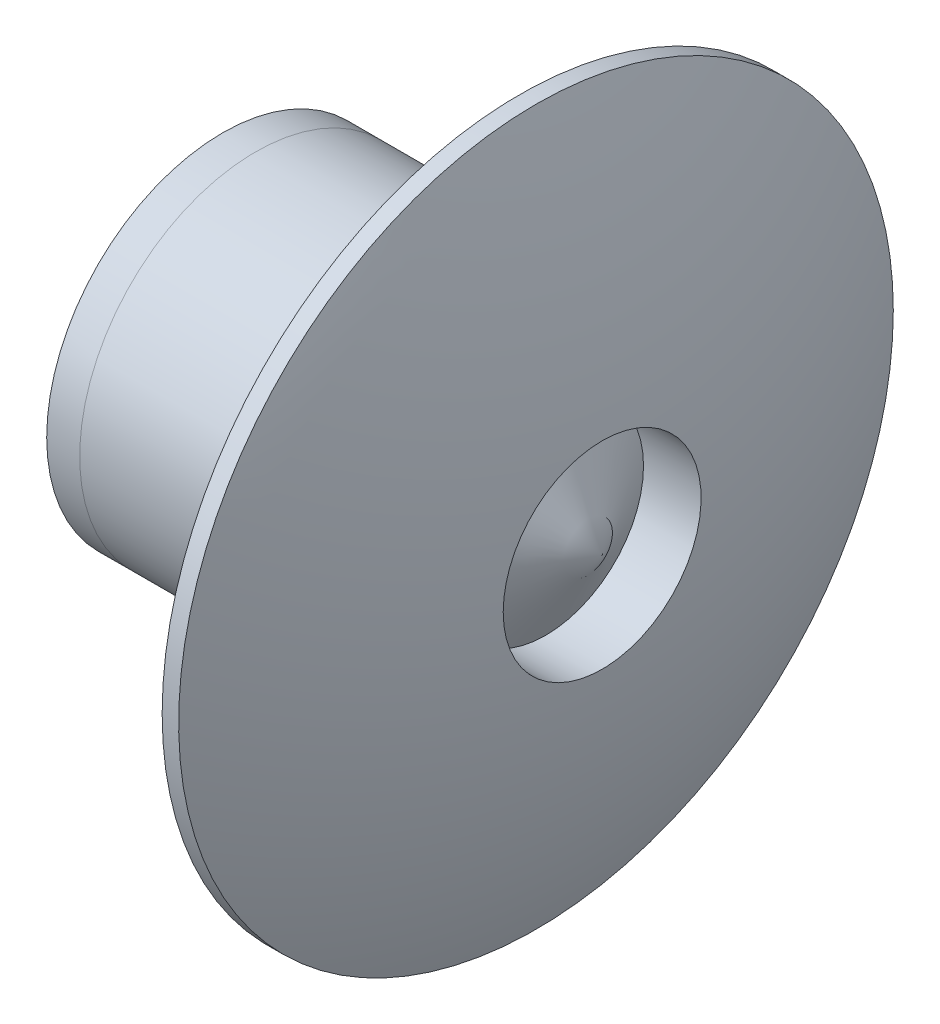
ISO-10303-21;
HEADER;
FILE_DESCRIPTION(('STEP AP214'),'2;1');
FILE_NAME('part.step','',(''),(''),'','','');
FILE_SCHEMA(('AUTOMOTIVE_DESIGN { 1 0 10303 214 1 1 1 1 }'));
ENDSEC;
DATA;
#1=APPLICATION_CONTEXT('core data for automotive mechanical design processes');
#2=APPLICATION_PROTOCOL_DEFINITION('international standard','automotive_design',2000,#1);
#3=PRODUCT_CONTEXT('',#1,'mechanical');
#4=PRODUCT('Part','Part','',(#3));
#5=PRODUCT_RELATED_PRODUCT_CATEGORY('part','',(#4));
#6=PRODUCT_DEFINITION_FORMATION('','',#4);
#7=PRODUCT_DEFINITION_CONTEXT('part definition',#1,'design');
#8=PRODUCT_DEFINITION('design','',#6,#7);
#9=PRODUCT_DEFINITION_SHAPE('','',#8);
#10=(LENGTH_UNIT() NAMED_UNIT(*) SI_UNIT(.MILLI.,.METRE.));
#11=(NAMED_UNIT(*) PLANE_ANGLE_UNIT() SI_UNIT($,.RADIAN.));
#12=(NAMED_UNIT(*) SI_UNIT($,.STERADIAN.) SOLID_ANGLE_UNIT());
#13=UNCERTAINTY_MEASURE_WITH_UNIT(LENGTH_MEASURE(1.E-05),#10,'distance_accuracy_value','');
#14=(GEOMETRIC_REPRESENTATION_CONTEXT(3) GLOBAL_UNCERTAINTY_ASSIGNED_CONTEXT((#13)) GLOBAL_UNIT_ASSIGNED_CONTEXT((#10,
#11,#12)) REPRESENTATION_CONTEXT('',''));
#15=CARTESIAN_POINT('',(0.,0.,0.));
#16=DIRECTION('',(0.,0.,1.));
#17=DIRECTION('',(1.,0.,0.));
#18=AXIS2_PLACEMENT_3D('',#15,#16,#17);
#19=CARTESIAN_POINT('',(0.751934301099957,0.,0.));
#20=DIRECTION('',(-1.,0.,0.));
#21=DIRECTION('',(0.,0.,1.));
#22=AXIS2_PLACEMENT_3D('',#19,#20,#21);
#23=CONICAL_SURFACE('',#22,0.,1.0471975511966);
#24=CARTESIAN_POINT('',(0.238092561521192,0.,0.));
#25=DIRECTION('',(1.,0.,0.));
#26=DIRECTION('',(0.,0.,-1.));
#27=AXIS2_PLACEMENT_3D('',#24,#25,#26);
#28=CIRCLE('',#27,0.89);
#29=CARTESIAN_POINT('',(0.238092561521192,0.,-0.89));
#30=VERTEX_POINT('',#29);
#31=EDGE_CURVE('E12',#30,#30,#28,.T.);
#32=ORIENTED_EDGE('',*,*,#31,.T.);
#33=EDGE_LOOP('',(#32));
#34=FACE_BOUND('',#33,.T.);
#35=CARTESIAN_POINT('',(0.751934301099957,0.,0.));
#36=VERTEX_POINT('',#35);
#37=VERTEX_LOOP('',#36);
#38=FACE_BOUND('',#37,.T.);
#39=ADVANCED_FACE('F50',(#34,#38),#23,.T.);
#40=CARTESIAN_POINT('',(0.,0.,0.));
#41=DIRECTION('',(1.,0.,0.));
#42=DIRECTION('',(0.,0.,-1.));
#43=AXIS2_PLACEMENT_3D('',#40,#41,#42);
#44=CYLINDRICAL_SURFACE('',#43,0.89);
#45=CARTESIAN_POINT('',(-1.1702439266261,0.,0.));
#46=DIRECTION('',(1.,0.,0.));
#47=DIRECTION('',(0.,0.,-1.));
#48=AXIS2_PLACEMENT_3D('',#45,#46,#47);
#49=CIRCLE('',#48,0.89);
#50=CARTESIAN_POINT('',(-1.1702439266261,0.,-0.89));
#51=VERTEX_POINT('',#50);
#52=EDGE_CURVE('E56',#51,#51,#49,.T.);
#53=ORIENTED_EDGE('',*,*,#52,.T.);
#54=EDGE_LOOP('',(#53));
#55=FACE_BOUND('',#54,.T.);
#56=ORIENTED_EDGE('',*,*,#31,.F.);
#57=EDGE_LOOP('',(#56));
#58=FACE_BOUND('',#57,.T.);
#59=ADVANCED_FACE('F60',(#55,#58),#44,.T.);
#60=CARTESIAN_POINT('',(-1.1702439266261,0.,0.));
#61=DIRECTION('',(-1.,0.,0.));
#62=DIRECTION('',(0.,0.,1.));
#63=AXIS2_PLACEMENT_3D('',#60,#61,#62);
#64=CONICAL_SURFACE('',#63,0.89,0.5235987755983);
#65=CARTESIAN_POINT('',(-2.4,0.,0.));
#66=DIRECTION('',(1.,0.,0.));
#67=DIRECTION('',(0.,0.,-1.));
#68=AXIS2_PLACEMENT_3D('',#65,#66,#67);
#69=CIRCLE('',#68,1.6);
#70=CARTESIAN_POINT('',(-2.4,0.,-1.6));
#71=VERTEX_POINT('',#70);
#72=EDGE_CURVE('E88',#71,#71,#69,.T.);
#73=ORIENTED_EDGE('',*,*,#72,.T.);
#74=EDGE_LOOP('',(#73));
#75=FACE_BOUND('',#74,.T.);
#76=ORIENTED_EDGE('',*,*,#52,.F.);
#77=EDGE_LOOP('',(#76));
#78=FACE_BOUND('',#77,.T.);
#79=ADVANCED_FACE('F65',(#75,#78),#64,.T.);
#80=CARTESIAN_POINT('',(0.,0.,0.));
#81=DIRECTION('',(1.,0.,0.));
#82=DIRECTION('',(0.,0.,-1.));
#83=AXIS2_PLACEMENT_3D('',#80,#81,#82);
#84=CYLINDRICAL_SURFACE('',#83,1.6);
#85=CARTESIAN_POINT('',(-2.7,0.,0.));
#86=DIRECTION('',(1.,0.,0.));
#87=DIRECTION('',(0.,0.,-1.));
#88=AXIS2_PLACEMENT_3D('',#85,#86,#87);
#89=CIRCLE('',#88,1.6);
#90=CARTESIAN_POINT('',(-2.7,0.,-1.6));
#91=VERTEX_POINT('',#90);
#92=EDGE_CURVE('E87',#91,#91,#89,.T.);
#93=ORIENTED_EDGE('',*,*,#92,.T.);
#94=EDGE_LOOP('',(#93));
#95=FACE_BOUND('',#94,.T.);
#96=ORIENTED_EDGE('',*,*,#72,.F.);
#97=EDGE_LOOP('',(#96));
#98=FACE_BOUND('',#97,.T.);
#99=ADVANCED_FACE('F72',(#95,#98),#84,.T.);
#100=CARTESIAN_POINT('',(-0.00774672167751234,0.,0.));
#101=DIRECTION('',(1.,0.,0.));
#102=DIRECTION('',(0.,1.,0.));
#103=AXIS2_PLACEMENT_3D('',#100,#101,#102);
#104=SPHERICAL_SURFACE('',#103,3.13180901630961);
#105=ORIENTED_EDGE('',*,*,#92,.F.);
#106=EDGE_LOOP('',(#105));
#107=FACE_BOUND('',#106,.T.);
#108=ADVANCED_FACE('F79',(#107),#104,.T.);
#109=CLOSED_SHELL('',(#39,#59,#79,#99,#108));
#110=MANIFOLD_SOLID_BREP('B2',#109);
#111=CARTESIAN_POINT('',(0.,0.,0.));
#112=DIRECTION('',(1.,0.,0.));
#113=DIRECTION('',(0.,0.,-1.));
#114=AXIS2_PLACEMENT_3D('',#111,#112,#113);
#115=CYLINDRICAL_SURFACE('',#114,3.25);
#116=CARTESIAN_POINT('',(0.,0.,0.));
#117=DIRECTION('',(1.,0.,0.));
#118=DIRECTION('',(0.,0.,-1.));
#119=AXIS2_PLACEMENT_3D('',#116,#117,#118);
#120=CIRCLE('',#119,3.25);
#121=CARTESIAN_POINT('',(0.,0.,-3.25));
#122=VERTEX_POINT('',#121);
#123=EDGE_CURVE('E156',#122,#122,#120,.T.);
#124=ORIENTED_EDGE('',*,*,#123,.T.);
#125=EDGE_LOOP('',(#124));
#126=FACE_BOUND('',#125,.T.);
#127=CARTESIAN_POINT('',(0.150000000000001,0.,0.));
#128=DIRECTION('',(1.,0.,0.));
#129=DIRECTION('',(0.,0.,-1.));
#130=AXIS2_PLACEMENT_3D('',#127,#128,#129);
#131=CIRCLE('',#130,3.25);
#132=CARTESIAN_POINT('',(0.150000000000001,3.25,0.));
#133=VERTEX_POINT('',#132);
#134=EDGE_CURVE('E144',#133,#133,#131,.T.);
#135=ORIENTED_EDGE('',*,*,#134,.F.);
#136=EDGE_LOOP('',(#135));
#137=FACE_BOUND('',#136,.T.);
#138=ADVANCED_FACE('F132',(#126,#137),#115,.T.);
#139=CARTESIAN_POINT('',(-7.65,0.,0.));
#140=DIRECTION('',(1.,0.,0.));
#141=DIRECTION('',(0.,1.,0.));
#142=AXIS2_PLACEMENT_3D('',#139,#140,#141);
#143=SPHERICAL_SURFACE('',#142,8.45);
#144=CARTESIAN_POINT('',(0.751934301099957,0.,0.));
#145=DIRECTION('',(-1.,0.,0.));
#146=DIRECTION('',(0.,0.,1.));
#147=AXIS2_PLACEMENT_3D('',#144,#145,#146);
#148=CIRCLE('',#147,0.899999999999999);
#149=CARTESIAN_POINT('',(0.751934301099958,0.899999999999981,0.));
#150=VERTEX_POINT('',#149);
#151=EDGE_CURVE('E159',#150,#150,#148,.F.);
#152=CARTESIAN_POINT('',(0.751934301099958,0.899999999999981,0.));
#153=CARTESIAN_POINT('',(0.749233555958905,0.925212790342708,0.));
#154=CARTESIAN_POINT('',(0.74641931533078,0.950413423202123,0.));
#155=CARTESIAN_POINT('',(0.740564085671962,1.00078833326963,0.));
#156=CARTESIAN_POINT('',(0.737523096641269,1.02596261047771,0.));
#157=CARTESIAN_POINT('',(0.731214612748893,1.07628276855786,0.));
#158=CARTESIAN_POINT('',(0.72794711788721,1.10142864942991,0.));
#159=CARTESIAN_POINT('',(0.721185888185465,1.15168997702698,0.));
#160=CARTESIAN_POINT('',(0.717692153345404,1.176805423752,0.));
#161=CARTESIAN_POINT('',(0.710478726555609,1.22700384755714,0.));
#162=CARTESIAN_POINT('',(0.706759034605875,1.25208682463727,0.));
#163=CARTESIAN_POINT('',(0.699093995131517,1.30221827632737,0.));
#164=CARTESIAN_POINT('',(0.695148647606892,1.32726675093734,0.));
#165=CARTESIAN_POINT('',(0.687032616710921,1.37732716764706,0.));
#166=CARTESIAN_POINT('',(0.682861933339575,1.40233910974681,0.));
#167=CARTESIAN_POINT('',(0.674295568765909,1.45232443435975,0.));
#168=CARTESIAN_POINT('',(0.669899887563589,1.47729781687294,0.));
#169=CARTESIAN_POINT('',(0.660883883571735,1.52720399836065,0.));
#170=CARTESIAN_POINT('',(0.6562635607822,1.55213679733517,0.));
#171=CARTESIAN_POINT('',(0.646798648067426,1.60195979108272,0.));
#172=CARTESIAN_POINT('',(0.641954058142188,1.62684998585575,0.));
#173=CARTESIAN_POINT('',(0.632041003782622,1.67658575399027,0.));
#174=CARTESIAN_POINT('',(0.626972539348294,1.70143132735176,0.));
#175=CARTESIAN_POINT('',(0.616612146741057,1.75107583906948,0.));
#176=CARTESIAN_POINT('',(0.611320218568148,1.7758747774257,0.));
#177=CARTESIAN_POINT('',(0.600513327364705,1.82542400931867,0.));
#178=CARTESIAN_POINT('',(0.59499836433417,1.85017430285542,0.));
#179=CARTESIAN_POINT('',(0.583745850372154,1.89962423923759,0.));
#180=CARTESIAN_POINT('',(0.578008299440673,1.92432388208302,0.));
#181=CARTESIAN_POINT('',(0.566311074672937,1.97367051531569,0.));
#182=CARTESIAN_POINT('',(0.560351400836682,1.99831750570293,0.));
#183=CARTESIAN_POINT('',(0.548210413257385,2.04755683651952,0.));
#184=CARTESIAN_POINT('',(0.542029099514343,2.07214917694888,0.));
#185=CARTESIAN_POINT('',(0.529445333082115,2.12127721477908,0.));
#186=CARTESIAN_POINT('',(0.523042880392931,2.14581291217992,0.));
#187=CARTESIAN_POINT('',(0.510017354951138,2.19482567547309,0.));
#188=CARTESIAN_POINT('',(0.50339428219853,2.2193027413654,0.));
#189=CARTESIAN_POINT('',(0.489928053392614,2.26819625791324,0.));
#190=CARTESIAN_POINT('',(0.483084897339306,2.29261270856875,0.));
#191=CARTESIAN_POINT('',(0.469179056531234,2.34138301582724,0.));
#192=CARTESIAN_POINT('',(0.46211637177647,2.36573687243021,0.));
#193=CARTESIAN_POINT('',(0.447772045956283,2.41438001784075,0.));
#194=CARTESIAN_POINT('',(0.44049040489086,2.43866930664831,0.));
#195=CARTESIAN_POINT('',(0.425708756585345,2.48718134795806,0.));
#196=CARTESIAN_POINT('',(0.418208749345253,2.51140410046024,0.));
#197=CARTESIAN_POINT('',(0.402990976523697,2.55978110604159,0.));
#198=CARTESIAN_POINT('',(0.395273210942233,2.58393535912076,0.));
#199=CARTESIAN_POINT('',(0.379620546919446,2.63217340829003,0.));
#200=CARTESIAN_POINT('',(0.371685648478122,2.65625720438012,0.));
#201=CARTESIAN_POINT('',(0.355599361814062,2.70435238771512,0.));
#202=CARTESIAN_POINT('',(0.347447973591326,2.72836377496002,0.));
#203=CARTESIAN_POINT('',(0.330929367989869,2.77631219461754,0.));
#204=CARTESIAN_POINT('',(0.322562150611147,2.80024922703016,0.));
#205=CARTESIAN_POINT('',(0.305612564808537,2.84804699705947,0.));
#206=CARTESIAN_POINT('',(0.297030196384648,2.87190773467617,0.));
#207=CARTESIAN_POINT('',(0.279651004062975,2.91955098134289,0.));
#208=CARTESIAN_POINT('',(0.270854180165192,2.94333349039292,0.));
#209=CARTESIAN_POINT('',(0.253046789759057,2.99081835245965,0.));
#210=CARTESIAN_POINT('',(0.244036223250706,3.01452070547635,0.));
#211=CARTESIAN_POINT('',(0.225802078139144,3.06184333463989,0.));
#212=CARTESIAN_POINT('',(0.216578499535933,3.08546361078674,0.));
#213=CARTESIAN_POINT('',(0.197919076783149,3.13262017152608,0.));
#214=CARTESIAN_POINT('',(0.188483232633576,3.15615645611859,0.));
#215=CARTESIAN_POINT('',(0.169400047132314,3.20314312773715,0.));
#216=CARTESIAN_POINT('',(0.159752705780625,3.22659351476321,0.));
#217=CARTESIAN_POINT('',(0.150000000000001,3.25,0.));
#218=B_SPLINE_CURVE_WITH_KNOTS('',3,(#152,#153,#154,#155,#156,#157,#158,#159,#160,#161,#162,
#163,#164,#165,#166,#167,#168,#169,#170,#171,#172,#173,#174,#175,#176,#177,#178,#179,#180,#181,
#182,#183,#184,#185,#186,#187,#188,#189,#190,#191,#192,#193,#194,#195,#196,#197,#198,#199,#200,
#201,#202,#203,#204,#205,#206,#207,#208,#209,#210,#211,#212,#213,#214,#215,#216,#217),
.UNSPECIFIED.,.F.,.F.,(4,2,2,2,2,2,2,2,2,2,2,2,2,2,2,2,2,2,2,2,2,2,2,2,2,2,2,2,2,2,2,2,4),(0.,
0.0760708242028812,0.152141648405764,0.228212472608645,0.304283296811528,0.380354121014409,
0.45642494521729,0.532495769420173,0.608566593623055,0.684637417825935,0.760708242028819,
0.836779066231699,0.91284989043458,0.988920714637463,1.06499153884034,1.14106236304323,
1.21713318724611,1.29320401144899,1.36927483565187,1.44534565985475,1.52141648405764,
1.59748730826052,1.6735581324634,1.74962895666628,1.82569978086916,1.90177060507204,
1.97784142927493,2.05391225347781,2.12998307768069,2.20605390188357,2.28212472608645,
2.35819555028933,2.43426637449222),.UNSPECIFIED.);
#219=EDGE_CURVE('BSEAM165',#150,#133,#218,.T.);
#220=ORIENTED_EDGE('',*,*,#151,.F.);
#221=ORIENTED_EDGE('',*,*,#134,.T.);
#222=ORIENTED_EDGE('',*,*,#219,.T.);
#223=ORIENTED_EDGE('',*,*,#219,.F.);
#224=EDGE_LOOP('',(#220,#222,#221,#223));
#225=FACE_BOUND('',#224,.T.);
#226=ADVANCED_FACE('F165',(#225),#143,.T.);
#227=CARTESIAN_POINT('',(-2.4,1.6,0.));
#228=DIRECTION('',(-1.,0.,0.));
#229=DIRECTION('',(0.,0.,1.));
#230=AXIS2_PLACEMENT_3D('',#227,#228,#229);
#231=PLANE('',#230);
#232=CARTESIAN_POINT('',(-2.4,0.,0.));
#233=DIRECTION('',(-1.,0.,0.));
#234=DIRECTION('',(0.,0.,1.));
#235=AXIS2_PLACEMENT_3D('',#232,#233,#234);
#236=CIRCLE('',#235,1.30414518843274);
#237=CARTESIAN_POINT('',(-2.4,0.,1.30414518843274));
#238=VERTEX_POINT('',#237);
#239=EDGE_CURVE('E49',#238,#238,#236,.F.);
#240=ORIENTED_EDGE('',*,*,#239,.T.);
#241=EDGE_LOOP('',(#240));
#242=FACE_BOUND('',#241,.T.);
#243=CARTESIAN_POINT('',(-2.4,0.,0.));
#244=DIRECTION('',(1.,0.,0.));
#245=DIRECTION('',(0.,0.,-1.));
#246=AXIS2_PLACEMENT_3D('',#243,#244,#245);
#247=CIRCLE('',#246,1.6);
#248=CARTESIAN_POINT('',(-2.4,0.,-1.6));
#249=VERTEX_POINT('',#248);
#250=EDGE_CURVE('E148',#249,#249,#247,.T.);
#251=ORIENTED_EDGE('',*,*,#250,.F.);
#252=EDGE_LOOP('',(#251));
#253=FACE_BOUND('',#252,.T.);
#254=ADVANCED_FACE('F168',(#242,#253),#231,.T.);
#255=CARTESIAN_POINT('',(0.,0.,0.));
#256=DIRECTION('',(1.,0.,0.));
#257=DIRECTION('',(0.,0.,-1.));
#258=AXIS2_PLACEMENT_3D('',#255,#256,#257);
#259=CYLINDRICAL_SURFACE('',#258,1.6);
#260=ORIENTED_EDGE('',*,*,#250,.T.);
#261=EDGE_LOOP('',(#260));
#262=FACE_BOUND('',#261,.T.);
#263=CARTESIAN_POINT('',(0.,0.,0.));
#264=DIRECTION('',(1.,0.,0.));
#265=DIRECTION('',(0.,0.,-1.));
#266=AXIS2_PLACEMENT_3D('',#263,#264,#265);
#267=CIRCLE('',#266,1.6);
#268=CARTESIAN_POINT('',(0.,0.,-1.6));
#269=VERTEX_POINT('',#268);
#270=EDGE_CURVE('E153',#269,#269,#267,.T.);
#271=ORIENTED_EDGE('',*,*,#270,.F.);
#272=EDGE_LOOP('',(#271));
#273=FACE_BOUND('',#272,.T.);
#274=ADVANCED_FACE('F179',(#262,#273),#259,.T.);
#275=CARTESIAN_POINT('',(0.,3.25,0.));
#276=DIRECTION('',(-1.,0.,0.));
#277=DIRECTION('',(0.,0.,1.));
#278=AXIS2_PLACEMENT_3D('',#275,#276,#277);
#279=PLANE('',#278);
#280=ORIENTED_EDGE('',*,*,#270,.T.);
#281=EDGE_LOOP('',(#280));
#282=FACE_BOUND('',#281,.T.);
#283=ORIENTED_EDGE('',*,*,#123,.F.);
#284=EDGE_LOOP('',(#283));
#285=FACE_BOUND('',#284,.T.);
#286=ADVANCED_FACE('F182',(#282,#285),#279,.T.);
#287=CARTESIAN_POINT('',(-2.4,0.,0.));
#288=DIRECTION('',(-1.,0.,0.));
#289=DIRECTION('',(0.,0.,1.));
#290=AXIS2_PLACEMENT_3D('',#287,#288,#289);
#291=CYLINDRICAL_SURFACE('',#290,0.899999999999999);
#292=CARTESIAN_POINT('',(-1.69999999999999,0.,0.));
#293=DIRECTION('',(-1.,0.,0.));
#294=DIRECTION('',(0.,0.,1.));
#295=AXIS2_PLACEMENT_3D('',#292,#293,#294);
#296=CIRCLE('',#295,0.899999999999999);
#297=CARTESIAN_POINT('',(-1.69999999999999,0.,0.899999999999999));
#298=VERTEX_POINT('',#297);
#299=EDGE_CURVE('E140',#298,#298,#296,.T.);
#300=ORIENTED_EDGE('',*,*,#299,.T.);
#301=EDGE_LOOP('',(#300));
#302=FACE_BOUND('',#301,.T.);
#303=ORIENTED_EDGE('',*,*,#151,.T.);
#304=EDGE_LOOP('',(#303));
#305=FACE_BOUND('',#304,.T.);
#306=ADVANCED_FACE('F163',(#302,#305),#291,.F.);
#307=CARTESIAN_POINT('',(-1.69999999999999,0.,0.));
#308=DIRECTION('',(-1.,0.,0.));
#309=DIRECTION('',(0.,0.,1.));
#310=AXIS2_PLACEMENT_3D('',#307,#308,#309);
#311=CONICAL_SURFACE('',#310,0.899999999999999,0.523598775598296);
#312=ORIENTED_EDGE('',*,*,#239,.F.);
#313=EDGE_LOOP('',(#312));
#314=FACE_BOUND('',#313,.T.);
#315=ORIENTED_EDGE('',*,*,#299,.F.);
#316=EDGE_LOOP('',(#315));
#317=FACE_BOUND('',#316,.T.);
#318=ADVANCED_FACE('F135',(#314,#317),#311,.F.);
#319=CLOSED_SHELL('',(#138,#226,#254,#274,#286,#306,#318));
#320=MANIFOLD_SOLID_BREP('B6',#319);
#321=ADVANCED_BREP_SHAPE_REPRESENTATION('',(#18,#110,#320),#14);
#322=SHAPE_DEFINITION_REPRESENTATION(#9,#321);
ENDSEC;
END-ISO-10303-21;
